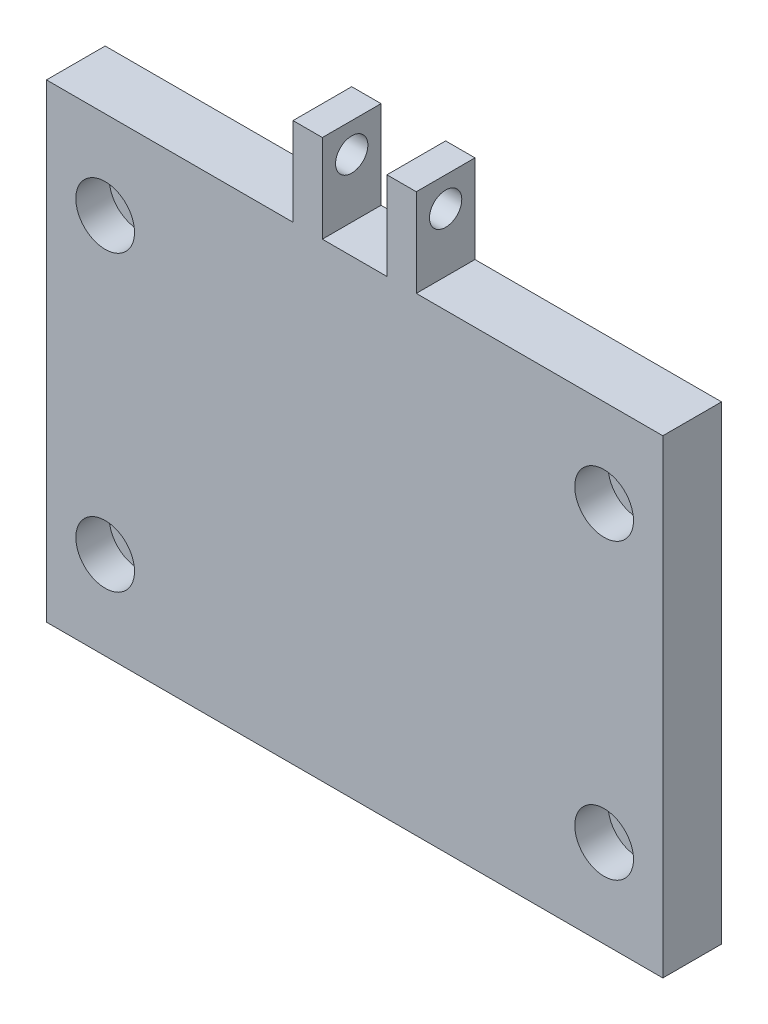
ISO-10303-21;
HEADER;
FILE_DESCRIPTION(('STEP AP214'),'2;1');
FILE_NAME('part.step','',(''),(''),'','','');
FILE_SCHEMA(('AUTOMOTIVE_DESIGN { 1 0 10303 214 1 1 1 1 }'));
ENDSEC;
DATA;
#1=APPLICATION_CONTEXT('core data for automotive mechanical design processes');
#2=APPLICATION_PROTOCOL_DEFINITION('international standard','automotive_design',2000,#1);
#3=PRODUCT_CONTEXT('',#1,'mechanical');
#4=PRODUCT('Part','Part','',(#3));
#5=PRODUCT_RELATED_PRODUCT_CATEGORY('part','',(#4));
#6=PRODUCT_DEFINITION_FORMATION('','',#4);
#7=PRODUCT_DEFINITION_CONTEXT('part definition',#1,'design');
#8=PRODUCT_DEFINITION('design','',#6,#7);
#9=PRODUCT_DEFINITION_SHAPE('','',#8);
#10=(LENGTH_UNIT() NAMED_UNIT(*) SI_UNIT(.MILLI.,.METRE.));
#11=(NAMED_UNIT(*) PLANE_ANGLE_UNIT() SI_UNIT($,.RADIAN.));
#12=(NAMED_UNIT(*) SI_UNIT($,.STERADIAN.) SOLID_ANGLE_UNIT());
#13=UNCERTAINTY_MEASURE_WITH_UNIT(LENGTH_MEASURE(1.E-05),#10,'distance_accuracy_value','');
#14=(GEOMETRIC_REPRESENTATION_CONTEXT(3) GLOBAL_UNCERTAINTY_ASSIGNED_CONTEXT((#13)) GLOBAL_UNIT_ASSIGNED_CONTEXT((#10,
#11,#12)) REPRESENTATION_CONTEXT('',''));
#15=CARTESIAN_POINT('',(0.,0.,0.));
#16=DIRECTION('',(0.,0.,1.));
#17=DIRECTION('',(1.,0.,0.));
#18=AXIS2_PLACEMENT_3D('',#15,#16,#17);
#19=CARTESIAN_POINT('',(0.,40.,5.));
#20=DIRECTION('',(0.,-1.,0.));
#21=DIRECTION('',(1.,0.,0.));
#22=AXIS2_PLACEMENT_3D('',#19,#20,#21);
#23=PLANE('',#22);
#24=DIRECTION('',(-1.,0.,0.));
#25=VECTOR('',#24,1.);
#26=CARTESIAN_POINT('',(0.,40.,-5.));
#27=LINE('',#26,#25);
#28=CARTESIAN_POINT('',(52.5,40.,-5.));
#29=VERTEX_POINT('',#28);
#30=CARTESIAN_POINT('',(10.5,40.,-5.));
#31=VERTEX_POINT('',#30);
#32=EDGE_CURVE('E161',#29,#31,#27,.T.);
#33=ORIENTED_EDGE('',*,*,#32,.T.);
#34=DIRECTION('',(0.,0.,-1.));
#35=VECTOR('',#34,1.);
#36=CARTESIAN_POINT('',(10.5,40.,5.));
#37=LINE('',#36,#35);
#38=CARTESIAN_POINT('',(10.5,40.,5.));
#39=VERTEX_POINT('',#38);
#40=EDGE_CURVE('E11',#39,#31,#37,.T.);
#41=ORIENTED_EDGE('',*,*,#40,.F.);
#42=DIRECTION('',(-1.,0.,0.));
#43=VECTOR('',#42,1.);
#44=CARTESIAN_POINT('',(0.,40.,5.));
#45=LINE('',#44,#43);
#46=CARTESIAN_POINT('',(52.5,40.,5.));
#47=VERTEX_POINT('',#46);
#48=EDGE_CURVE('E187',#47,#39,#45,.T.);
#49=ORIENTED_EDGE('',*,*,#48,.F.);
#50=DIRECTION('',(0.,0.,-1.));
#51=VECTOR('',#50,1.);
#52=CARTESIAN_POINT('',(52.5,40.,5.));
#53=LINE('',#52,#51);
#54=EDGE_CURVE('E55',#47,#29,#53,.T.);
#55=ORIENTED_EDGE('',*,*,#54,.T.);
#56=EDGE_LOOP('',(#33,#41,#49,#55));
#57=FACE_BOUND('',#56,.T.);
#58=ADVANCED_FACE('F38',(#57),#23,.F.);
#59=CARTESIAN_POINT('',(10.5,0.,5.));
#60=DIRECTION('',(-1.,0.,0.));
#61=DIRECTION('',(0.,-1.,0.));
#62=AXIS2_PLACEMENT_3D('',#59,#60,#61);
#63=PLANE('',#62);
#64=CARTESIAN_POINT('',(10.5,50.,0.));
#65=DIRECTION('',(-1.,0.,0.));
#66=DIRECTION('',(0.,-1.,0.));
#67=AXIS2_PLACEMENT_3D('',#64,#65,#66);
#68=CIRCLE('',#67,2.75);
#69=CARTESIAN_POINT('',(10.5,47.25,0.));
#70=VERTEX_POINT('',#69);
#71=EDGE_CURVE('E252',#70,#70,#68,.T.);
#72=ORIENTED_EDGE('',*,*,#71,.T.);
#73=EDGE_LOOP('',(#72));
#74=FACE_BOUND('',#73,.T.);
#75=DIRECTION('',(0.,1.,0.));
#76=VECTOR('',#75,1.);
#77=CARTESIAN_POINT('',(10.5,0.,-5.));
#78=LINE('',#77,#76);
#79=CARTESIAN_POINT('',(10.5,55.,-5.));
#80=VERTEX_POINT('',#79);
#81=EDGE_CURVE('E163',#31,#80,#78,.T.);
#82=ORIENTED_EDGE('',*,*,#81,.T.);
#83=DIRECTION('',(0.,0.,-1.));
#84=VECTOR('',#83,1.);
#85=CARTESIAN_POINT('',(10.5,55.,5.));
#86=LINE('',#85,#84);
#87=CARTESIAN_POINT('',(10.5,55.,5.));
#88=VERTEX_POINT('',#87);
#89=EDGE_CURVE('E47',#88,#80,#86,.T.);
#90=ORIENTED_EDGE('',*,*,#89,.F.);
#91=DIRECTION('',(0.,1.,0.));
#92=VECTOR('',#91,1.);
#93=CARTESIAN_POINT('',(10.5,0.,5.));
#94=LINE('',#93,#92);
#95=EDGE_CURVE('E105',#39,#88,#94,.T.);
#96=ORIENTED_EDGE('',*,*,#95,.F.);
#97=ORIENTED_EDGE('',*,*,#40,.T.);
#98=EDGE_LOOP('',(#82,#90,#96,#97));
#99=FACE_BOUND('',#98,.T.);
#100=ADVANCED_FACE('F40',(#74,#99),#63,.F.);
#101=CARTESIAN_POINT('',(0.,55.,5.));
#102=DIRECTION('',(0.,-1.,0.));
#103=DIRECTION('',(0.,0.,-1.));
#104=AXIS2_PLACEMENT_3D('',#101,#102,#103);
#105=PLANE('',#104);
#106=DIRECTION('',(-1.,0.,0.));
#107=VECTOR('',#106,1.);
#108=CARTESIAN_POINT('',(0.,55.,-5.));
#109=LINE('',#108,#107);
#110=CARTESIAN_POINT('',(5.5,55.,-5.));
#111=VERTEX_POINT('',#110);
#112=EDGE_CURVE('E168',#80,#111,#109,.T.);
#113=ORIENTED_EDGE('',*,*,#112,.T.);
#114=DIRECTION('',(0.,0.,-1.));
#115=VECTOR('',#114,1.);
#116=CARTESIAN_POINT('',(5.5,55.,5.));
#117=LINE('',#116,#115);
#118=CARTESIAN_POINT('',(5.5,55.,5.));
#119=VERTEX_POINT('',#118);
#120=EDGE_CURVE('E202',#119,#111,#117,.T.);
#121=ORIENTED_EDGE('',*,*,#120,.F.);
#122=DIRECTION('',(-1.,0.,0.));
#123=VECTOR('',#122,1.);
#124=CARTESIAN_POINT('',(0.,55.,5.));
#125=LINE('',#124,#123);
#126=EDGE_CURVE('E210',#88,#119,#125,.T.);
#127=ORIENTED_EDGE('',*,*,#126,.F.);
#128=ORIENTED_EDGE('',*,*,#89,.T.);
#129=EDGE_LOOP('',(#113,#121,#127,#128));
#130=FACE_BOUND('',#129,.T.);
#131=ADVANCED_FACE('F208',(#130),#105,.F.);
#132=CARTESIAN_POINT('',(5.5,0.,5.));
#133=DIRECTION('',(1.,0.,0.));
#134=DIRECTION('',(0.,0.,-1.));
#135=AXIS2_PLACEMENT_3D('',#132,#133,#134);
#136=PLANE('',#135);
#137=CARTESIAN_POINT('',(5.5,50.,0.));
#138=DIRECTION('',(1.,0.,0.));
#139=DIRECTION('',(0.,0.,-1.));
#140=AXIS2_PLACEMENT_3D('',#137,#138,#139);
#141=CIRCLE('',#140,2.75);
#142=CARTESIAN_POINT('',(5.5,50.,-2.75));
#143=VERTEX_POINT('',#142);
#144=EDGE_CURVE('E255',#143,#143,#141,.T.);
#145=ORIENTED_EDGE('',*,*,#144,.T.);
#146=EDGE_LOOP('',(#145));
#147=FACE_BOUND('',#146,.T.);
#148=DIRECTION('',(0.,-1.,0.));
#149=VECTOR('',#148,1.);
#150=CARTESIAN_POINT('',(5.5,0.,-5.));
#151=LINE('',#150,#149);
#152=CARTESIAN_POINT('',(5.5,40.,-5.));
#153=VERTEX_POINT('',#152);
#154=EDGE_CURVE('E170',#111,#153,#151,.T.);
#155=ORIENTED_EDGE('',*,*,#154,.T.);
#156=DIRECTION('',(0.,0.,-1.));
#157=VECTOR('',#156,1.);
#158=CARTESIAN_POINT('',(5.5,40.,5.));
#159=LINE('',#158,#157);
#160=CARTESIAN_POINT('',(5.5,40.,5.));
#161=VERTEX_POINT('',#160);
#162=EDGE_CURVE('E199',#161,#153,#159,.T.);
#163=ORIENTED_EDGE('',*,*,#162,.F.);
#164=DIRECTION('',(0.,-1.,0.));
#165=VECTOR('',#164,1.);
#166=CARTESIAN_POINT('',(5.5,0.,5.));
#167=LINE('',#166,#165);
#168=EDGE_CURVE('E228',#119,#161,#167,.T.);
#169=ORIENTED_EDGE('',*,*,#168,.F.);
#170=ORIENTED_EDGE('',*,*,#120,.T.);
#171=EDGE_LOOP('',(#155,#163,#169,#170));
#172=FACE_BOUND('',#171,.T.);
#173=ADVANCED_FACE('F218',(#147,#172),#136,.F.);
#174=CARTESIAN_POINT('',(-5.5,40.,-5.));
#175=VERTEX_POINT('',#174);
#176=EDGE_CURVE('E166',#153,#175,#27,.T.);
#177=ORIENTED_EDGE('',*,*,#176,.T.);
#178=DIRECTION('',(0.,0.,-1.));
#179=VECTOR('',#178,1.);
#180=CARTESIAN_POINT('',(-5.5,40.,5.));
#181=LINE('',#180,#179);
#182=CARTESIAN_POINT('',(-5.5,40.,5.));
#183=VERTEX_POINT('',#182);
#184=EDGE_CURVE('E197',#183,#175,#181,.T.);
#185=ORIENTED_EDGE('',*,*,#184,.F.);
#186=EDGE_CURVE('E224',#161,#183,#45,.T.);
#187=ORIENTED_EDGE('',*,*,#186,.F.);
#188=ORIENTED_EDGE('',*,*,#162,.T.);
#189=EDGE_LOOP('',(#177,#185,#187,#188));
#190=FACE_BOUND('',#189,.T.);
#191=ADVANCED_FACE('F222',(#190),#23,.F.);
#192=CARTESIAN_POINT('',(-5.49999999999999,0.,5.));
#193=DIRECTION('',(1.,0.,0.));
#194=DIRECTION('',(0.,1.,0.));
#195=AXIS2_PLACEMENT_3D('',#192,#193,#194);
#196=PLANE('',#195);
#197=CARTESIAN_POINT('',(-5.50000000000001,50.,0.));
#198=DIRECTION('',(1.,0.,0.));
#199=DIRECTION('',(0.,1.,0.));
#200=AXIS2_PLACEMENT_3D('',#197,#198,#199);
#201=CIRCLE('',#200,2.75);
#202=CARTESIAN_POINT('',(-5.50000000000001,52.75,0.));
#203=VERTEX_POINT('',#202);
#204=EDGE_CURVE('E261',#203,#203,#201,.T.);
#205=ORIENTED_EDGE('',*,*,#204,.F.);
#206=EDGE_LOOP('',(#205));
#207=FACE_BOUND('',#206,.T.);
#208=DIRECTION('',(0.,-1.,0.));
#209=VECTOR('',#208,1.);
#210=CARTESIAN_POINT('',(-5.49999999999999,0.,-5.));
#211=LINE('',#210,#209);
#212=CARTESIAN_POINT('',(-5.5,55.,-5.));
#213=VERTEX_POINT('',#212);
#214=EDGE_CURVE('E172',#213,#175,#211,.T.);
#215=ORIENTED_EDGE('',*,*,#214,.F.);
#216=DIRECTION('',(0.,0.,-1.));
#217=VECTOR('',#216,1.);
#218=CARTESIAN_POINT('',(-5.5,55.,5.));
#219=LINE('',#218,#217);
#220=CARTESIAN_POINT('',(-5.5,55.,5.));
#221=VERTEX_POINT('',#220);
#222=EDGE_CURVE('E195',#221,#213,#219,.T.);
#223=ORIENTED_EDGE('',*,*,#222,.F.);
#224=DIRECTION('',(0.,-1.,0.));
#225=VECTOR('',#224,1.);
#226=CARTESIAN_POINT('',(-5.49999999999999,0.,5.));
#227=LINE('',#226,#225);
#228=EDGE_CURVE('E227',#221,#183,#227,.T.);
#229=ORIENTED_EDGE('',*,*,#228,.T.);
#230=ORIENTED_EDGE('',*,*,#184,.T.);
#231=EDGE_LOOP('',(#215,#223,#229,#230));
#232=FACE_BOUND('',#231,.T.);
#233=ADVANCED_FACE('F355',(#207,#232),#196,.T.);
#234=CARTESIAN_POINT('',(0.,55.,5.));
#235=DIRECTION('',(0.,1.,0.));
#236=DIRECTION('',(0.,0.,1.));
#237=AXIS2_PLACEMENT_3D('',#234,#235,#236);
#238=PLANE('',#237);
#239=DIRECTION('',(1.,0.,0.));
#240=VECTOR('',#239,1.);
#241=CARTESIAN_POINT('',(0.,55.,-5.));
#242=LINE('',#241,#240);
#243=CARTESIAN_POINT('',(-10.5,55.,-5.));
#244=VERTEX_POINT('',#243);
#245=EDGE_CURVE('E175',#244,#213,#242,.T.);
#246=ORIENTED_EDGE('',*,*,#245,.F.);
#247=DIRECTION('',(0.,0.,-1.));
#248=VECTOR('',#247,1.);
#249=CARTESIAN_POINT('',(-10.5,55.,5.));
#250=LINE('',#249,#248);
#251=CARTESIAN_POINT('',(-10.5,55.,5.));
#252=VERTEX_POINT('',#251);
#253=EDGE_CURVE('E193',#252,#244,#250,.T.);
#254=ORIENTED_EDGE('',*,*,#253,.F.);
#255=DIRECTION('',(1.,0.,0.));
#256=VECTOR('',#255,1.);
#257=CARTESIAN_POINT('',(0.,55.,5.));
#258=LINE('',#257,#256);
#259=EDGE_CURVE('E230',#252,#221,#258,.T.);
#260=ORIENTED_EDGE('',*,*,#259,.T.);
#261=ORIENTED_EDGE('',*,*,#222,.T.);
#262=EDGE_LOOP('',(#246,#254,#260,#261));
#263=FACE_BOUND('',#262,.T.);
#264=ADVANCED_FACE('F351',(#263),#238,.T.);
#265=CARTESIAN_POINT('',(-10.5,0.,5.));
#266=DIRECTION('',(-1.,0.,0.));
#267=DIRECTION('',(0.,-1.,0.));
#268=AXIS2_PLACEMENT_3D('',#265,#266,#267);
#269=PLANE('',#268);
#270=CARTESIAN_POINT('',(-10.5,50.,0.));
#271=DIRECTION('',(-1.,0.,0.));
#272=DIRECTION('',(0.,-1.,0.));
#273=AXIS2_PLACEMENT_3D('',#270,#271,#272);
#274=CIRCLE('',#273,2.75);
#275=CARTESIAN_POINT('',(-10.5,47.25,0.));
#276=VERTEX_POINT('',#275);
#277=EDGE_CURVE('E610',#276,#276,#274,.T.);
#278=ORIENTED_EDGE('',*,*,#277,.F.);
#279=EDGE_LOOP('',(#278));
#280=FACE_BOUND('',#279,.T.);
#281=DIRECTION('',(0.,1.,0.));
#282=VECTOR('',#281,1.);
#283=CARTESIAN_POINT('',(-10.5,0.,-5.));
#284=LINE('',#283,#282);
#285=CARTESIAN_POINT('',(-10.5,40.,-5.));
#286=VERTEX_POINT('',#285);
#287=EDGE_CURVE('E178',#286,#244,#284,.T.);
#288=ORIENTED_EDGE('',*,*,#287,.F.);
#289=DIRECTION('',(0.,0.,-1.));
#290=VECTOR('',#289,1.);
#291=CARTESIAN_POINT('',(-10.5,40.,5.));
#292=LINE('',#291,#290);
#293=CARTESIAN_POINT('',(-10.5,40.,5.));
#294=VERTEX_POINT('',#293);
#295=EDGE_CURVE('E191',#294,#286,#292,.T.);
#296=ORIENTED_EDGE('',*,*,#295,.F.);
#297=DIRECTION('',(0.,1.,0.));
#298=VECTOR('',#297,1.);
#299=CARTESIAN_POINT('',(-10.5,0.,5.));
#300=LINE('',#299,#298);
#301=EDGE_CURVE('E235',#294,#252,#300,.T.);
#302=ORIENTED_EDGE('',*,*,#301,.T.);
#303=ORIENTED_EDGE('',*,*,#253,.T.);
#304=EDGE_LOOP('',(#288,#296,#302,#303));
#305=FACE_BOUND('',#304,.T.);
#306=ADVANCED_FACE('F347',(#280,#305),#269,.T.);
#307=CARTESIAN_POINT('',(-52.5,40.,-5.));
#308=VERTEX_POINT('',#307);
#309=EDGE_CURVE('E165',#286,#308,#27,.T.);
#310=ORIENTED_EDGE('',*,*,#309,.T.);
#311=DIRECTION('',(0.,0.,-1.));
#312=VECTOR('',#311,1.);
#313=CARTESIAN_POINT('',(-52.5,40.,5.));
#314=LINE('',#313,#312);
#315=CARTESIAN_POINT('',(-52.5,40.,5.));
#316=VERTEX_POINT('',#315);
#317=EDGE_CURVE('E153',#316,#308,#314,.T.);
#318=ORIENTED_EDGE('',*,*,#317,.F.);
#319=EDGE_CURVE('E141',#294,#316,#45,.T.);
#320=ORIENTED_EDGE('',*,*,#319,.F.);
#321=ORIENTED_EDGE('',*,*,#295,.T.);
#322=EDGE_LOOP('',(#310,#318,#320,#321));
#323=FACE_BOUND('',#322,.T.);
#324=ADVANCED_FACE('F249',(#323),#23,.F.);
#325=CARTESIAN_POINT('',(-52.5,0.,5.));
#326=DIRECTION('',(1.,0.,0.));
#327=DIRECTION('',(0.,1.,0.));
#328=AXIS2_PLACEMENT_3D('',#325,#326,#327);
#329=PLANE('',#328);
#330=DIRECTION('',(0.,-1.,0.));
#331=VECTOR('',#330,1.);
#332=CARTESIAN_POINT('',(-52.5,0.,-5.));
#333=LINE('',#332,#331);
#334=CARTESIAN_POINT('',(-52.5,-40.,-5.));
#335=VERTEX_POINT('',#334);
#336=EDGE_CURVE('E150',#308,#335,#333,.T.);
#337=ORIENTED_EDGE('',*,*,#336,.T.);
#338=DIRECTION('',(0.,0.,-1.));
#339=VECTOR('',#338,1.);
#340=CARTESIAN_POINT('',(-52.5,-40.,5.));
#341=LINE('',#340,#339);
#342=CARTESIAN_POINT('',(-52.5,-40.,5.));
#343=VERTEX_POINT('',#342);
#344=EDGE_CURVE('E147',#343,#335,#341,.T.);
#345=ORIENTED_EDGE('',*,*,#344,.F.);
#346=DIRECTION('',(0.,-1.,0.));
#347=VECTOR('',#346,1.);
#348=CARTESIAN_POINT('',(-52.5,0.,5.));
#349=LINE('',#348,#347);
#350=EDGE_CURVE('E133',#316,#343,#349,.T.);
#351=ORIENTED_EDGE('',*,*,#350,.F.);
#352=ORIENTED_EDGE('',*,*,#317,.T.);
#353=EDGE_LOOP('',(#337,#345,#351,#352));
#354=FACE_BOUND('',#353,.T.);
#355=ADVANCED_FACE('F148',(#354),#329,.F.);
#356=CARTESIAN_POINT('',(0.,-40.,5.));
#357=DIRECTION('',(0.,-1.,0.));
#358=DIRECTION('',(1.,0.,0.));
#359=AXIS2_PLACEMENT_3D('',#356,#357,#358);
#360=PLANE('',#359);
#361=DIRECTION('',(-1.,0.,0.));
#362=VECTOR('',#361,1.);
#363=CARTESIAN_POINT('',(0.,-40.,-5.));
#364=LINE('',#363,#362);
#365=CARTESIAN_POINT('',(52.5,-40.,-5.));
#366=VERTEX_POINT('',#365);
#367=EDGE_CURVE('E182',#366,#335,#364,.T.);
#368=ORIENTED_EDGE('',*,*,#367,.F.);
#369=DIRECTION('',(0.,0.,-1.));
#370=VECTOR('',#369,1.);
#371=CARTESIAN_POINT('',(52.5,-40.,5.));
#372=LINE('',#371,#370);
#373=CARTESIAN_POINT('',(52.5,-40.,5.));
#374=VERTEX_POINT('',#373);
#375=EDGE_CURVE('E93',#374,#366,#372,.T.);
#376=ORIENTED_EDGE('',*,*,#375,.F.);
#377=DIRECTION('',(-1.,0.,0.));
#378=VECTOR('',#377,1.);
#379=CARTESIAN_POINT('',(0.,-40.,5.));
#380=LINE('',#379,#378);
#381=EDGE_CURVE('E138',#374,#343,#380,.T.);
#382=ORIENTED_EDGE('',*,*,#381,.T.);
#383=ORIENTED_EDGE('',*,*,#344,.T.);
#384=EDGE_LOOP('',(#368,#376,#382,#383));
#385=FACE_BOUND('',#384,.T.);
#386=ADVANCED_FACE('F155',(#385),#360,.T.);
#387=CARTESIAN_POINT('',(52.5,0.,5.));
#388=DIRECTION('',(1.,0.,0.));
#389=DIRECTION('',(0.,1.,0.));
#390=AXIS2_PLACEMENT_3D('',#387,#388,#389);
#391=PLANE('',#390);
#392=DIRECTION('',(0.,-1.,0.));
#393=VECTOR('',#392,1.);
#394=CARTESIAN_POINT('',(52.5,0.,-5.));
#395=LINE('',#394,#393);
#396=EDGE_CURVE('E184',#29,#366,#395,.T.);
#397=ORIENTED_EDGE('',*,*,#396,.F.);
#398=ORIENTED_EDGE('',*,*,#54,.F.);
#399=DIRECTION('',(0.,-1.,0.));
#400=VECTOR('',#399,1.);
#401=CARTESIAN_POINT('',(52.5,0.,5.));
#402=LINE('',#401,#400);
#403=EDGE_CURVE('E156',#47,#374,#402,.T.);
#404=ORIENTED_EDGE('',*,*,#403,.T.);
#405=ORIENTED_EDGE('',*,*,#375,.T.);
#406=EDGE_LOOP('',(#397,#398,#404,#405));
#407=FACE_BOUND('',#406,.T.);
#408=ADVANCED_FACE('F329',(#407),#391,.T.);
#409=CARTESIAN_POINT('',(0.,0.,5.));
#410=DIRECTION('',(0.,0.,1.));
#411=DIRECTION('',(1.,0.,0.));
#412=AXIS2_PLACEMENT_3D('',#409,#410,#411);
#413=PLANE('',#412);
#414=CARTESIAN_POINT('',(-42.5,25.,5.));
#415=DIRECTION('',(0.,0.,1.));
#416=DIRECTION('',(1.,0.,0.));
#417=AXIS2_PLACEMENT_3D('',#414,#415,#416);
#418=CIRCLE('',#417,5.);
#419=CARTESIAN_POINT('',(-37.5,25.,5.));
#420=VERTEX_POINT('',#419);
#421=EDGE_CURVE('E254',#420,#420,#418,.T.);
#422=ORIENTED_EDGE('',*,*,#421,.F.);
#423=EDGE_LOOP('',(#422));
#424=FACE_BOUND('',#423,.T.);
#425=CARTESIAN_POINT('',(42.5,25.,5.));
#426=DIRECTION('',(0.,0.,1.));
#427=DIRECTION('',(1.,0.,0.));
#428=AXIS2_PLACEMENT_3D('',#425,#426,#427);
#429=CIRCLE('',#428,5.);
#430=CARTESIAN_POINT('',(47.5,25.,5.));
#431=VERTEX_POINT('',#430);
#432=EDGE_CURVE('E273',#431,#431,#429,.T.);
#433=ORIENTED_EDGE('',*,*,#432,.F.);
#434=EDGE_LOOP('',(#433));
#435=FACE_BOUND('',#434,.T.);
#436=CARTESIAN_POINT('',(42.5,-25.,5.));
#437=DIRECTION('',(0.,0.,1.));
#438=DIRECTION('',(1.,0.,0.));
#439=AXIS2_PLACEMENT_3D('',#436,#437,#438);
#440=CIRCLE('',#439,5.);
#441=CARTESIAN_POINT('',(47.5,-25.,5.));
#442=VERTEX_POINT('',#441);
#443=EDGE_CURVE('E285',#442,#442,#440,.T.);
#444=ORIENTED_EDGE('',*,*,#443,.F.);
#445=EDGE_LOOP('',(#444));
#446=FACE_BOUND('',#445,.T.);
#447=CARTESIAN_POINT('',(-42.5,-25.,5.));
#448=DIRECTION('',(0.,0.,1.));
#449=DIRECTION('',(1.,0.,0.));
#450=AXIS2_PLACEMENT_3D('',#447,#448,#449);
#451=CIRCLE('',#450,5.);
#452=CARTESIAN_POINT('',(-37.5,-25.,5.));
#453=VERTEX_POINT('',#452);
#454=EDGE_CURVE('E297',#453,#453,#451,.T.);
#455=ORIENTED_EDGE('',*,*,#454,.F.);
#456=EDGE_LOOP('',(#455));
#457=FACE_BOUND('',#456,.T.);
#458=ORIENTED_EDGE('',*,*,#48,.T.);
#459=ORIENTED_EDGE('',*,*,#95,.T.);
#460=ORIENTED_EDGE('',*,*,#126,.T.);
#461=ORIENTED_EDGE('',*,*,#168,.T.);
#462=ORIENTED_EDGE('',*,*,#186,.T.);
#463=ORIENTED_EDGE('',*,*,#228,.F.);
#464=ORIENTED_EDGE('',*,*,#259,.F.);
#465=ORIENTED_EDGE('',*,*,#301,.F.);
#466=ORIENTED_EDGE('',*,*,#319,.T.);
#467=ORIENTED_EDGE('',*,*,#350,.T.);
#468=ORIENTED_EDGE('',*,*,#381,.F.);
#469=ORIENTED_EDGE('',*,*,#403,.F.);
#470=EDGE_LOOP('',(#458,#459,#460,#461,#462,#463,#464,#465,#466,#467,#468,#469));
#471=FACE_BOUND('',#470,.T.);
#472=ADVANCED_FACE('F135',(#424,#435,#446,#457,#471),#413,.T.);
#473=CARTESIAN_POINT('',(0.,0.,-5.));
#474=DIRECTION('',(0.,0.,1.));
#475=DIRECTION('',(1.,0.,0.));
#476=AXIS2_PLACEMENT_3D('',#473,#474,#475);
#477=PLANE('',#476);
#478=CARTESIAN_POINT('',(-42.5,25.,-5.));
#479=DIRECTION('',(0.,0.,1.));
#480=DIRECTION('',(1.,0.,0.));
#481=AXIS2_PLACEMENT_3D('',#478,#479,#480);
#482=CIRCLE('',#481,2.75);
#483=CARTESIAN_POINT('',(-39.75,25.,-5.));
#484=VERTEX_POINT('',#483);
#485=EDGE_CURVE('E270',#484,#484,#482,.T.);
#486=ORIENTED_EDGE('',*,*,#485,.T.);
#487=EDGE_LOOP('',(#486));
#488=FACE_BOUND('',#487,.T.);
#489=CARTESIAN_POINT('',(42.5,25.,-5.));
#490=DIRECTION('',(0.,0.,1.));
#491=DIRECTION('',(1.,0.,0.));
#492=AXIS2_PLACEMENT_3D('',#489,#490,#491);
#493=CIRCLE('',#492,2.75);
#494=CARTESIAN_POINT('',(45.25,25.,-5.));
#495=VERTEX_POINT('',#494);
#496=EDGE_CURVE('E282',#495,#495,#493,.T.);
#497=ORIENTED_EDGE('',*,*,#496,.T.);
#498=EDGE_LOOP('',(#497));
#499=FACE_BOUND('',#498,.T.);
#500=CARTESIAN_POINT('',(42.5,-25.,-5.));
#501=DIRECTION('',(0.,0.,1.));
#502=DIRECTION('',(1.,0.,0.));
#503=AXIS2_PLACEMENT_3D('',#500,#501,#502);
#504=CIRCLE('',#503,2.75);
#505=CARTESIAN_POINT('',(45.25,-25.,-5.));
#506=VERTEX_POINT('',#505);
#507=EDGE_CURVE('E294',#506,#506,#504,.T.);
#508=ORIENTED_EDGE('',*,*,#507,.T.);
#509=EDGE_LOOP('',(#508));
#510=FACE_BOUND('',#509,.T.);
#511=CARTESIAN_POINT('',(-42.5,-25.,-5.));
#512=DIRECTION('',(0.,0.,1.));
#513=DIRECTION('',(1.,0.,0.));
#514=AXIS2_PLACEMENT_3D('',#511,#512,#513);
#515=CIRCLE('',#514,2.75);
#516=CARTESIAN_POINT('',(-39.75,-25.,-5.));
#517=VERTEX_POINT('',#516);
#518=EDGE_CURVE('E164',#517,#517,#515,.T.);
#519=ORIENTED_EDGE('',*,*,#518,.T.);
#520=EDGE_LOOP('',(#519));
#521=FACE_BOUND('',#520,.T.);
#522=ORIENTED_EDGE('',*,*,#32,.F.);
#523=ORIENTED_EDGE('',*,*,#396,.T.);
#524=ORIENTED_EDGE('',*,*,#367,.T.);
#525=ORIENTED_EDGE('',*,*,#336,.F.);
#526=ORIENTED_EDGE('',*,*,#309,.F.);
#527=ORIENTED_EDGE('',*,*,#287,.T.);
#528=ORIENTED_EDGE('',*,*,#245,.T.);
#529=ORIENTED_EDGE('',*,*,#214,.T.);
#530=ORIENTED_EDGE('',*,*,#176,.F.);
#531=ORIENTED_EDGE('',*,*,#154,.F.);
#532=ORIENTED_EDGE('',*,*,#112,.F.);
#533=ORIENTED_EDGE('',*,*,#81,.F.);
#534=EDGE_LOOP('',(#522,#523,#524,#525,#526,#527,#528,#529,#530,#531,#532,#533));
#535=FACE_BOUND('',#534,.T.);
#536=ADVANCED_FACE('F213',(#488,#499,#510,#521,#535),#477,.F.);
#537=CARTESIAN_POINT('',(-42.5,-25.,5.));
#538=DIRECTION('',(0.,0.,1.));
#539=DIRECTION('',(1.,0.,0.));
#540=AXIS2_PLACEMENT_3D('',#537,#538,#539);
#541=CYLINDRICAL_SURFACE('',#540,2.75);
#542=ORIENTED_EDGE('',*,*,#518,.F.);
#543=EDGE_LOOP('',(#542));
#544=FACE_BOUND('',#543,.T.);
#545=CARTESIAN_POINT('',(-42.5,-25.,-0.7));
#546=DIRECTION('',(0.,0.,1.));
#547=DIRECTION('',(1.,0.,0.));
#548=AXIS2_PLACEMENT_3D('',#545,#546,#547);
#549=CIRCLE('',#548,2.75);
#550=CARTESIAN_POINT('',(-39.75,-25.,-0.7));
#551=VERTEX_POINT('',#550);
#552=EDGE_CURVE('E303',#551,#551,#549,.T.);
#553=ORIENTED_EDGE('',*,*,#552,.T.);
#554=EDGE_LOOP('',(#553));
#555=FACE_BOUND('',#554,.T.);
#556=ADVANCED_FACE('F309',(#544,#555),#541,.F.);
#557=CARTESIAN_POINT('',(-39.75,-25.,-0.7));
#558=DIRECTION('',(0.,0.,-1.));
#559=DIRECTION('',(-1.,0.,0.));
#560=AXIS2_PLACEMENT_3D('',#557,#558,#559);
#561=PLANE('',#560);
#562=ORIENTED_EDGE('',*,*,#552,.F.);
#563=EDGE_LOOP('',(#562));
#564=FACE_BOUND('',#563,.T.);
#565=CARTESIAN_POINT('',(-42.5,-25.,-0.7));
#566=DIRECTION('',(0.,0.,1.));
#567=DIRECTION('',(1.,0.,0.));
#568=AXIS2_PLACEMENT_3D('',#565,#566,#567);
#569=CIRCLE('',#568,5.);
#570=CARTESIAN_POINT('',(-37.5,-25.,-0.7));
#571=VERTEX_POINT('',#570);
#572=EDGE_CURVE('E300',#571,#571,#569,.T.);
#573=ORIENTED_EDGE('',*,*,#572,.T.);
#574=EDGE_LOOP('',(#573));
#575=FACE_BOUND('',#574,.T.);
#576=ADVANCED_FACE('F312',(#564,#575),#561,.F.);
#577=CARTESIAN_POINT('',(-42.5,-25.,5.));
#578=DIRECTION('',(0.,0.,1.));
#579=DIRECTION('',(1.,0.,0.));
#580=AXIS2_PLACEMENT_3D('',#577,#578,#579);
#581=CYLINDRICAL_SURFACE('',#580,5.);
#582=ORIENTED_EDGE('',*,*,#572,.F.);
#583=EDGE_LOOP('',(#582));
#584=FACE_BOUND('',#583,.T.);
#585=ORIENTED_EDGE('',*,*,#454,.T.);
#586=EDGE_LOOP('',(#585));
#587=FACE_BOUND('',#586,.T.);
#588=ADVANCED_FACE('F318',(#584,#587),#581,.F.);
#589=CARTESIAN_POINT('',(42.5,-25.,5.));
#590=DIRECTION('',(0.,0.,1.));
#591=DIRECTION('',(1.,0.,0.));
#592=AXIS2_PLACEMENT_3D('',#589,#590,#591);
#593=CYLINDRICAL_SURFACE('',#592,2.75);
#594=ORIENTED_EDGE('',*,*,#507,.F.);
#595=EDGE_LOOP('',(#594));
#596=FACE_BOUND('',#595,.T.);
#597=CARTESIAN_POINT('',(42.5,-25.,-0.7));
#598=DIRECTION('',(0.,0.,1.));
#599=DIRECTION('',(1.,0.,0.));
#600=AXIS2_PLACEMENT_3D('',#597,#598,#599);
#601=CIRCLE('',#600,2.75);
#602=CARTESIAN_POINT('',(45.25,-25.,-0.7));
#603=VERTEX_POINT('',#602);
#604=EDGE_CURVE('E291',#603,#603,#601,.T.);
#605=ORIENTED_EDGE('',*,*,#604,.T.);
#606=EDGE_LOOP('',(#605));
#607=FACE_BOUND('',#606,.T.);
#608=ADVANCED_FACE('F324',(#596,#607),#593,.F.);
#609=CARTESIAN_POINT('',(45.25,-25.,-0.7));
#610=DIRECTION('',(0.,0.,-1.));
#611=DIRECTION('',(-1.,0.,0.));
#612=AXIS2_PLACEMENT_3D('',#609,#610,#611);
#613=PLANE('',#612);
#614=ORIENTED_EDGE('',*,*,#604,.F.);
#615=EDGE_LOOP('',(#614));
#616=FACE_BOUND('',#615,.T.);
#617=CARTESIAN_POINT('',(42.5,-25.,-0.7));
#618=DIRECTION('',(0.,0.,1.));
#619=DIRECTION('',(1.,0.,0.));
#620=AXIS2_PLACEMENT_3D('',#617,#618,#619);
#621=CIRCLE('',#620,5.);
#622=CARTESIAN_POINT('',(47.5,-25.,-0.7));
#623=VERTEX_POINT('',#622);
#624=EDGE_CURVE('E288',#623,#623,#621,.T.);
#625=ORIENTED_EDGE('',*,*,#624,.T.);
#626=EDGE_LOOP('',(#625));
#627=FACE_BOUND('',#626,.T.);
#628=ADVANCED_FACE('F403',(#616,#627),#613,.F.);
#629=CARTESIAN_POINT('',(42.5,-25.,5.));
#630=DIRECTION('',(0.,0.,1.));
#631=DIRECTION('',(1.,0.,0.));
#632=AXIS2_PLACEMENT_3D('',#629,#630,#631);
#633=CYLINDRICAL_SURFACE('',#632,5.);
#634=ORIENTED_EDGE('',*,*,#624,.F.);
#635=EDGE_LOOP('',(#634));
#636=FACE_BOUND('',#635,.T.);
#637=ORIENTED_EDGE('',*,*,#443,.T.);
#638=EDGE_LOOP('',(#637));
#639=FACE_BOUND('',#638,.T.);
#640=ADVANCED_FACE('F399',(#636,#639),#633,.F.);
#641=CARTESIAN_POINT('',(42.5,25.,5.));
#642=DIRECTION('',(0.,0.,1.));
#643=DIRECTION('',(1.,0.,0.));
#644=AXIS2_PLACEMENT_3D('',#641,#642,#643);
#645=CYLINDRICAL_SURFACE('',#644,2.75);
#646=ORIENTED_EDGE('',*,*,#496,.F.);
#647=EDGE_LOOP('',(#646));
#648=FACE_BOUND('',#647,.T.);
#649=CARTESIAN_POINT('',(42.5,25.,-0.7));
#650=DIRECTION('',(0.,0.,1.));
#651=DIRECTION('',(1.,0.,0.));
#652=AXIS2_PLACEMENT_3D('',#649,#650,#651);
#653=CIRCLE('',#652,2.75);
#654=CARTESIAN_POINT('',(45.25,25.,-0.7));
#655=VERTEX_POINT('',#654);
#656=EDGE_CURVE('E279',#655,#655,#653,.T.);
#657=ORIENTED_EDGE('',*,*,#656,.T.);
#658=EDGE_LOOP('',(#657));
#659=FACE_BOUND('',#658,.T.);
#660=ADVANCED_FACE('F395',(#648,#659),#645,.F.);
#661=CARTESIAN_POINT('',(45.25,25.,-0.7));
#662=DIRECTION('',(0.,0.,-1.));
#663=DIRECTION('',(-1.,0.,0.));
#664=AXIS2_PLACEMENT_3D('',#661,#662,#663);
#665=PLANE('',#664);
#666=ORIENTED_EDGE('',*,*,#656,.F.);
#667=EDGE_LOOP('',(#666));
#668=FACE_BOUND('',#667,.T.);
#669=CARTESIAN_POINT('',(42.5,25.,-0.7));
#670=DIRECTION('',(0.,0.,1.));
#671=DIRECTION('',(1.,0.,0.));
#672=AXIS2_PLACEMENT_3D('',#669,#670,#671);
#673=CIRCLE('',#672,5.);
#674=CARTESIAN_POINT('',(47.5,25.,-0.7));
#675=VERTEX_POINT('',#674);
#676=EDGE_CURVE('E276',#675,#675,#673,.T.);
#677=ORIENTED_EDGE('',*,*,#676,.T.);
#678=EDGE_LOOP('',(#677));
#679=FACE_BOUND('',#678,.T.);
#680=ADVANCED_FACE('F391',(#668,#679),#665,.F.);
#681=CARTESIAN_POINT('',(42.5,25.,5.));
#682=DIRECTION('',(0.,0.,1.));
#683=DIRECTION('',(1.,0.,0.));
#684=AXIS2_PLACEMENT_3D('',#681,#682,#683);
#685=CYLINDRICAL_SURFACE('',#684,5.);
#686=ORIENTED_EDGE('',*,*,#676,.F.);
#687=EDGE_LOOP('',(#686));
#688=FACE_BOUND('',#687,.T.);
#689=ORIENTED_EDGE('',*,*,#432,.T.);
#690=EDGE_LOOP('',(#689));
#691=FACE_BOUND('',#690,.T.);
#692=ADVANCED_FACE('F387',(#688,#691),#685,.F.);
#693=CARTESIAN_POINT('',(-42.5,25.,5.));
#694=DIRECTION('',(0.,0.,1.));
#695=DIRECTION('',(1.,0.,0.));
#696=AXIS2_PLACEMENT_3D('',#693,#694,#695);
#697=CYLINDRICAL_SURFACE('',#696,2.75);
#698=ORIENTED_EDGE('',*,*,#485,.F.);
#699=EDGE_LOOP('',(#698));
#700=FACE_BOUND('',#699,.T.);
#701=CARTESIAN_POINT('',(-42.5,25.,-0.7));
#702=DIRECTION('',(0.,0.,1.));
#703=DIRECTION('',(1.,0.,0.));
#704=AXIS2_PLACEMENT_3D('',#701,#702,#703);
#705=CIRCLE('',#704,2.75);
#706=CARTESIAN_POINT('',(-39.75,25.,-0.7));
#707=VERTEX_POINT('',#706);
#708=EDGE_CURVE('E267',#707,#707,#705,.T.);
#709=ORIENTED_EDGE('',*,*,#708,.T.);
#710=EDGE_LOOP('',(#709));
#711=FACE_BOUND('',#710,.T.);
#712=ADVANCED_FACE('F383',(#700,#711),#697,.F.);
#713=CARTESIAN_POINT('',(-39.75,25.,-0.7));
#714=DIRECTION('',(0.,0.,-1.));
#715=DIRECTION('',(-1.,0.,0.));
#716=AXIS2_PLACEMENT_3D('',#713,#714,#715);
#717=PLANE('',#716);
#718=ORIENTED_EDGE('',*,*,#708,.F.);
#719=EDGE_LOOP('',(#718));
#720=FACE_BOUND('',#719,.T.);
#721=CARTESIAN_POINT('',(-42.5,25.,-0.7));
#722=DIRECTION('',(0.,0.,1.));
#723=DIRECTION('',(1.,0.,0.));
#724=AXIS2_PLACEMENT_3D('',#721,#722,#723);
#725=CIRCLE('',#724,5.);
#726=CARTESIAN_POINT('',(-37.5,25.,-0.7));
#727=VERTEX_POINT('',#726);
#728=EDGE_CURVE('E258',#727,#727,#725,.T.);
#729=ORIENTED_EDGE('',*,*,#728,.T.);
#730=EDGE_LOOP('',(#729));
#731=FACE_BOUND('',#730,.T.);
#732=ADVANCED_FACE('F379',(#720,#731),#717,.F.);
#733=CARTESIAN_POINT('',(-42.5,25.,5.));
#734=DIRECTION('',(0.,0.,1.));
#735=DIRECTION('',(1.,0.,0.));
#736=AXIS2_PLACEMENT_3D('',#733,#734,#735);
#737=CYLINDRICAL_SURFACE('',#736,5.);
#738=ORIENTED_EDGE('',*,*,#728,.F.);
#739=EDGE_LOOP('',(#738));
#740=FACE_BOUND('',#739,.T.);
#741=ORIENTED_EDGE('',*,*,#421,.T.);
#742=EDGE_LOOP('',(#741));
#743=FACE_BOUND('',#742,.T.);
#744=ADVANCED_FACE('F374',(#740,#743),#737,.F.);
#745=CARTESIAN_POINT('',(52.5,50.,0.));
#746=DIRECTION('',(-1.,0.,0.));
#747=DIRECTION('',(0.,-1.,0.));
#748=AXIS2_PLACEMENT_3D('',#745,#746,#747);
#749=CYLINDRICAL_SURFACE('',#748,2.75);
#750=ORIENTED_EDGE('',*,*,#204,.T.);
#751=EDGE_LOOP('',(#750));
#752=FACE_BOUND('',#751,.T.);
#753=ORIENTED_EDGE('',*,*,#277,.T.);
#754=EDGE_LOOP('',(#753));
#755=FACE_BOUND('',#754,.T.);
#756=ADVANCED_FACE('F369',(#752,#755),#749,.F.);
#757=ORIENTED_EDGE('',*,*,#144,.F.);
#758=EDGE_LOOP('',(#757));
#759=FACE_BOUND('',#758,.T.);
#760=ORIENTED_EDGE('',*,*,#71,.F.);
#761=EDGE_LOOP('',(#760));
#762=FACE_BOUND('',#761,.T.);
#763=ADVANCED_FACE('F367',(#759,#762),#749,.F.);
#764=CLOSED_SHELL('',(#58,#100,#131,#173,#191,#233,#264,#306,#324,#355,#386,#408,#472,#536,#556,
#576,#588,#608,#628,#640,#660,#680,#692,#712,#732,#744,#756,#763));
#765=MANIFOLD_SOLID_BREP('B2',#764);
#766=ADVANCED_BREP_SHAPE_REPRESENTATION('',(#18,#765),#14);
#767=SHAPE_DEFINITION_REPRESENTATION(#9,#766);
ENDSEC;
END-ISO-10303-21;
